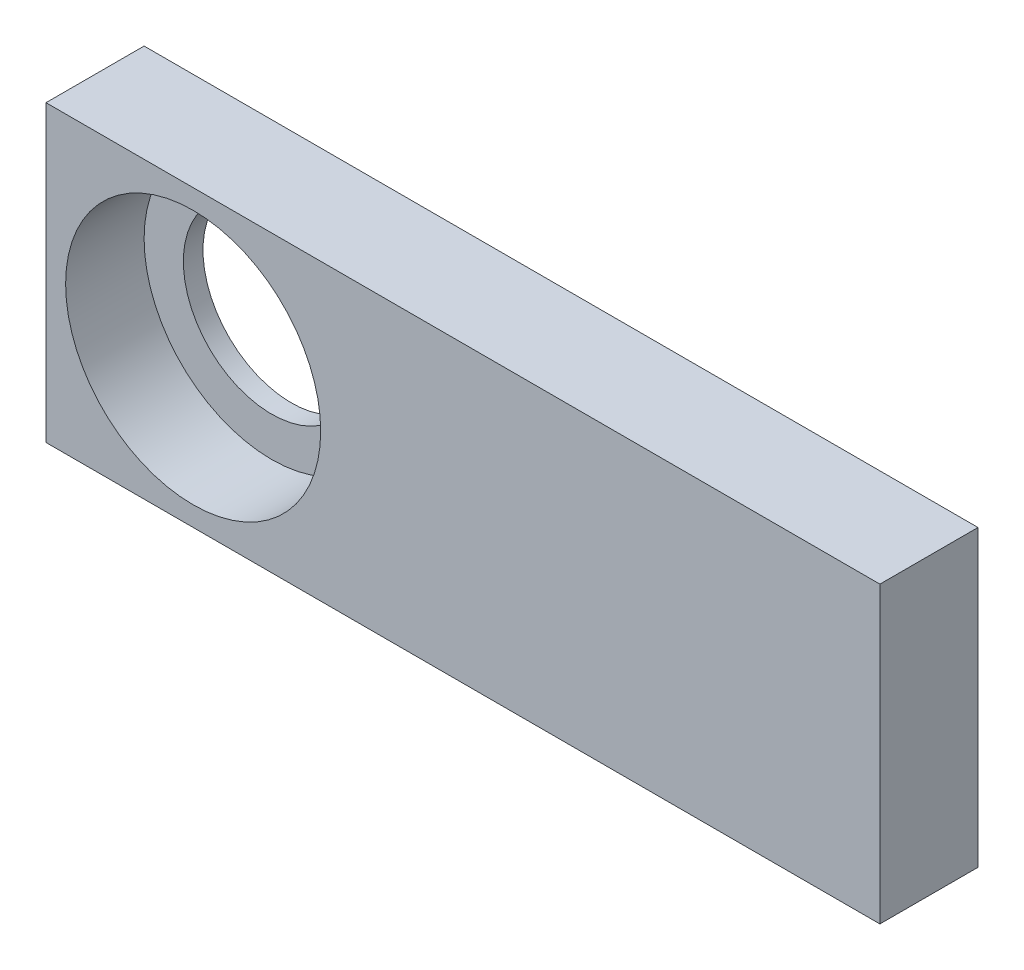
ISO-10303-21;
HEADER;
FILE_DESCRIPTION(('STEP AP214'),'2;1');
FILE_NAME('part.step','',(''),(''),'','','');
FILE_SCHEMA(('AUTOMOTIVE_DESIGN { 1 0 10303 214 1 1 1 1 }'));
ENDSEC;
DATA;
#1=APPLICATION_CONTEXT('core data for automotive mechanical design processes');
#2=APPLICATION_PROTOCOL_DEFINITION('international standard','automotive_design',2000,#1);
#3=PRODUCT_CONTEXT('',#1,'mechanical');
#4=PRODUCT('Part','Part','',(#3));
#5=PRODUCT_RELATED_PRODUCT_CATEGORY('part','',(#4));
#6=PRODUCT_DEFINITION_FORMATION('','',#4);
#7=PRODUCT_DEFINITION_CONTEXT('part definition',#1,'design');
#8=PRODUCT_DEFINITION('design','',#6,#7);
#9=PRODUCT_DEFINITION_SHAPE('','',#8);
#10=(LENGTH_UNIT() NAMED_UNIT(*) SI_UNIT(.MILLI.,.METRE.));
#11=(NAMED_UNIT(*) PLANE_ANGLE_UNIT() SI_UNIT($,.RADIAN.));
#12=(NAMED_UNIT(*) SI_UNIT($,.STERADIAN.) SOLID_ANGLE_UNIT());
#13=UNCERTAINTY_MEASURE_WITH_UNIT(LENGTH_MEASURE(1.E-05),#10,'distance_accuracy_value','');
#14=(GEOMETRIC_REPRESENTATION_CONTEXT(3) GLOBAL_UNCERTAINTY_ASSIGNED_CONTEXT((#13)) GLOBAL_UNIT_ASSIGNED_CONTEXT((#10,
#11,#12)) REPRESENTATION_CONTEXT('',''));
#15=CARTESIAN_POINT('',(0.,0.,0.));
#16=DIRECTION('',(0.,0.,1.));
#17=DIRECTION('',(1.,0.,0.));
#18=AXIS2_PLACEMENT_3D('',#15,#16,#17);
#19=CARTESIAN_POINT('',(-75.,15.,10.));
#20=DIRECTION('',(1.,0.,0.));
#21=DIRECTION('',(0.,0.,-1.));
#22=AXIS2_PLACEMENT_3D('',#19,#20,#21);
#23=PLANE('',#22);
#24=DIRECTION('',(0.,-1.,0.));
#25=VECTOR('',#24,1.);
#26=CARTESIAN_POINT('',(-75.,15.,0.));
#27=LINE('',#26,#25);
#28=CARTESIAN_POINT('',(-75.,15.,0.));
#29=VERTEX_POINT('',#28);
#30=CARTESIAN_POINT('',(-75.,-15.,0.));
#31=VERTEX_POINT('',#30);
#32=EDGE_CURVE('E82',#29,#31,#27,.T.);
#33=ORIENTED_EDGE('',*,*,#32,.T.);
#34=DIRECTION('',(0.,0.,-1.));
#35=VECTOR('',#34,1.);
#36=CARTESIAN_POINT('',(-75.,-15.,10.));
#37=LINE('',#36,#35);
#38=CARTESIAN_POINT('',(-75.,-15.,10.));
#39=VERTEX_POINT('',#38);
#40=EDGE_CURVE('E11',#39,#31,#37,.T.);
#41=ORIENTED_EDGE('',*,*,#40,.F.);
#42=DIRECTION('',(0.,-1.,0.));
#43=VECTOR('',#42,1.);
#44=CARTESIAN_POINT('',(-75.,15.,10.));
#45=LINE('',#44,#43);
#46=CARTESIAN_POINT('',(-75.,15.,10.));
#47=VERTEX_POINT('',#46);
#48=EDGE_CURVE('E76',#47,#39,#45,.T.);
#49=ORIENTED_EDGE('',*,*,#48,.F.);
#50=DIRECTION('',(0.,0.,-1.));
#51=VECTOR('',#50,1.);
#52=CARTESIAN_POINT('',(-75.,15.,10.));
#53=LINE('',#52,#51);
#54=EDGE_CURVE('E38',#47,#29,#53,.T.);
#55=ORIENTED_EDGE('',*,*,#54,.T.);
#56=EDGE_LOOP('',(#33,#41,#49,#55));
#57=FACE_BOUND('',#56,.T.);
#58=ADVANCED_FACE('F31',(#57),#23,.F.);
#59=CARTESIAN_POINT('',(-75.,-15.,10.));
#60=DIRECTION('',(0.,1.,0.));
#61=DIRECTION('',(0.,0.,1.));
#62=AXIS2_PLACEMENT_3D('',#59,#60,#61);
#63=PLANE('',#62);
#64=DIRECTION('',(1.,0.,0.));
#65=VECTOR('',#64,1.);
#66=CARTESIAN_POINT('',(-75.,-15.,0.));
#67=LINE('',#66,#65);
#68=CARTESIAN_POINT('',(10.,-15.,0.));
#69=VERTEX_POINT('',#68);
#70=EDGE_CURVE('E77',#31,#69,#67,.T.);
#71=ORIENTED_EDGE('',*,*,#70,.T.);
#72=DIRECTION('',(0.,0.,-1.));
#73=VECTOR('',#72,1.);
#74=CARTESIAN_POINT('',(10.,-15.,0.));
#75=LINE('',#74,#73);
#76=CARTESIAN_POINT('',(10.,-15.,10.));
#77=VERTEX_POINT('',#76);
#78=EDGE_CURVE('E45',#77,#69,#75,.T.);
#79=ORIENTED_EDGE('',*,*,#78,.F.);
#80=DIRECTION('',(1.,0.,0.));
#81=VECTOR('',#80,1.);
#82=CARTESIAN_POINT('',(-75.,-15.,10.));
#83=LINE('',#82,#81);
#84=EDGE_CURVE('E93',#39,#77,#83,.T.);
#85=ORIENTED_EDGE('',*,*,#84,.F.);
#86=ORIENTED_EDGE('',*,*,#40,.T.);
#87=EDGE_LOOP('',(#71,#79,#85,#86));
#88=FACE_BOUND('',#87,.T.);
#89=ADVANCED_FACE('F118',(#88),#63,.F.);
#90=CARTESIAN_POINT('',(-75.,15.,10.));
#91=DIRECTION('',(0.,-1.,0.));
#92=DIRECTION('',(0.,0.,-1.));
#93=AXIS2_PLACEMENT_3D('',#90,#91,#92);
#94=PLANE('',#93);
#95=DIRECTION('',(-1.,0.,0.));
#96=VECTOR('',#95,1.);
#97=CARTESIAN_POINT('',(-75.,15.,10.));
#98=LINE('',#97,#96);
#99=CARTESIAN_POINT('',(10.,15.,10.));
#100=VERTEX_POINT('',#99);
#101=EDGE_CURVE('E54',#100,#47,#98,.T.);
#102=ORIENTED_EDGE('',*,*,#101,.F.);
#103=DIRECTION('',(0.,0.,1.));
#104=VECTOR('',#103,1.);
#105=CARTESIAN_POINT('',(10.,15.,0.));
#106=LINE('',#105,#104);
#107=CARTESIAN_POINT('',(10.,15.,0.));
#108=VERTEX_POINT('',#107);
#109=EDGE_CURVE('E73',#108,#100,#106,.T.);
#110=ORIENTED_EDGE('',*,*,#109,.F.);
#111=DIRECTION('',(-1.,0.,0.));
#112=VECTOR('',#111,1.);
#113=CARTESIAN_POINT('',(-75.,15.,0.));
#114=LINE('',#113,#112);
#115=EDGE_CURVE('E68',#108,#29,#114,.T.);
#116=ORIENTED_EDGE('',*,*,#115,.T.);
#117=ORIENTED_EDGE('',*,*,#54,.F.);
#118=EDGE_LOOP('',(#102,#110,#116,#117));
#119=FACE_BOUND('',#118,.T.);
#120=ADVANCED_FACE('F70',(#119),#94,.F.);
#121=CARTESIAN_POINT('',(-75.,-15.,10.));
#122=DIRECTION('',(0.,0.,1.));
#123=DIRECTION('',(1.,0.,0.));
#124=AXIS2_PLACEMENT_3D('',#121,#122,#123);
#125=PLANE('',#124);
#126=DIRECTION('',(0.,-1.,0.));
#127=VECTOR('',#126,1.);
#128=CARTESIAN_POINT('',(10.,15.001,10.));
#129=LINE('',#128,#127);
#130=EDGE_CURVE('E106',#100,#77,#129,.T.);
#131=ORIENTED_EDGE('',*,*,#130,.F.);
#132=ORIENTED_EDGE('',*,*,#101,.T.);
#133=ORIENTED_EDGE('',*,*,#48,.T.);
#134=ORIENTED_EDGE('',*,*,#84,.T.);
#135=EDGE_LOOP('',(#131,#132,#133,#134));
#136=FACE_BOUND('',#135,.T.);
#137=CARTESIAN_POINT('',(-60.,0.,10.));
#138=DIRECTION('',(0.,0.,1.));
#139=DIRECTION('',(1.,0.,0.));
#140=AXIS2_PLACEMENT_3D('',#137,#138,#139);
#141=CIRCLE('',#140,13.);
#142=CARTESIAN_POINT('',(-47.,0.,10.));
#143=VERTEX_POINT('',#142);
#144=EDGE_CURVE('E89',#143,#143,#141,.T.);
#145=ORIENTED_EDGE('',*,*,#144,.F.);
#146=EDGE_LOOP('',(#145));
#147=FACE_BOUND('',#146,.T.);
#148=ADVANCED_FACE('F114',(#136,#147),#125,.T.);
#149=CARTESIAN_POINT('',(-75.,-15.,0.));
#150=DIRECTION('',(0.,0.,1.));
#151=DIRECTION('',(1.,0.,0.));
#152=AXIS2_PLACEMENT_3D('',#149,#150,#151);
#153=PLANE('',#152);
#154=CARTESIAN_POINT('',(-60.,0.,0.));
#155=DIRECTION('',(0.,0.,1.));
#156=DIRECTION('',(1.,0.,0.));
#157=AXIS2_PLACEMENT_3D('',#154,#155,#156);
#158=CIRCLE('',#157,9.);
#159=CARTESIAN_POINT('',(-51.,0.,0.));
#160=VERTEX_POINT('',#159);
#161=EDGE_CURVE('E98',#160,#160,#158,.F.);
#162=ORIENTED_EDGE('',*,*,#161,.F.);
#163=EDGE_LOOP('',(#162));
#164=FACE_BOUND('',#163,.T.);
#165=ORIENTED_EDGE('',*,*,#115,.F.);
#166=DIRECTION('',(0.,-1.,0.));
#167=VECTOR('',#166,1.);
#168=CARTESIAN_POINT('',(10.,15.001,0.));
#169=LINE('',#168,#167);
#170=EDGE_CURVE('E105',#108,#69,#169,.T.);
#171=ORIENTED_EDGE('',*,*,#170,.T.);
#172=ORIENTED_EDGE('',*,*,#70,.F.);
#173=ORIENTED_EDGE('',*,*,#32,.F.);
#174=EDGE_LOOP('',(#165,#171,#172,#173));
#175=FACE_BOUND('',#174,.T.);
#176=ADVANCED_FACE('F83',(#164,#175),#153,.F.);
#177=CARTESIAN_POINT('',(-60.,0.,2.));
#178=DIRECTION('',(0.,0.,1.));
#179=DIRECTION('',(1.,0.,0.));
#180=AXIS2_PLACEMENT_3D('',#177,#178,#179);
#181=CYLINDRICAL_SURFACE('',#180,13.);
#182=CARTESIAN_POINT('',(-60.,0.,2.));
#183=DIRECTION('',(0.,0.,1.));
#184=DIRECTION('',(1.,0.,0.));
#185=AXIS2_PLACEMENT_3D('',#182,#183,#184);
#186=CIRCLE('',#185,13.);
#187=CARTESIAN_POINT('',(-47.,0.,2.));
#188=VERTEX_POINT('',#187);
#189=EDGE_CURVE('E85',#188,#188,#186,.T.);
#190=ORIENTED_EDGE('',*,*,#189,.F.);
#191=EDGE_LOOP('',(#190));
#192=FACE_BOUND('',#191,.T.);
#193=ORIENTED_EDGE('',*,*,#144,.T.);
#194=EDGE_LOOP('',(#193));
#195=FACE_BOUND('',#194,.T.);
#196=ADVANCED_FACE('F128',(#192,#195),#181,.F.);
#197=CARTESIAN_POINT('',(-60.,0.,2.));
#198=DIRECTION('',(0.,0.,1.));
#199=DIRECTION('',(1.,0.,0.));
#200=AXIS2_PLACEMENT_3D('',#197,#198,#199);
#201=PLANE('',#200);
#202=CARTESIAN_POINT('',(-60.,0.,2.));
#203=DIRECTION('',(0.,0.,1.));
#204=DIRECTION('',(1.,0.,0.));
#205=AXIS2_PLACEMENT_3D('',#202,#203,#204);
#206=CIRCLE('',#205,9.);
#207=CARTESIAN_POINT('',(-51.,0.,2.));
#208=VERTEX_POINT('',#207);
#209=EDGE_CURVE('E102',#208,#208,#206,.T.);
#210=ORIENTED_EDGE('',*,*,#209,.F.);
#211=EDGE_LOOP('',(#210));
#212=FACE_BOUND('',#211,.T.);
#213=ORIENTED_EDGE('',*,*,#189,.T.);
#214=EDGE_LOOP('',(#213));
#215=FACE_BOUND('',#214,.T.);
#216=ADVANCED_FACE('F134',(#212,#215),#201,.T.);
#217=CARTESIAN_POINT('',(-60.,0.,-0.00100000000000013));
#218=DIRECTION('',(0.,0.,1.));
#219=DIRECTION('',(1.,0.,0.));
#220=AXIS2_PLACEMENT_3D('',#217,#218,#219);
#221=CYLINDRICAL_SURFACE('',#220,9.);
#222=ORIENTED_EDGE('',*,*,#209,.T.);
#223=EDGE_LOOP('',(#222));
#224=FACE_BOUND('',#223,.T.);
#225=ORIENTED_EDGE('',*,*,#161,.T.);
#226=EDGE_LOOP('',(#225));
#227=FACE_BOUND('',#226,.T.);
#228=ADVANCED_FACE('F138',(#224,#227),#221,.F.);
#229=CARTESIAN_POINT('',(10.,15.001,0.));
#230=DIRECTION('',(-1.,0.,0.));
#231=DIRECTION('',(0.,0.,1.));
#232=AXIS2_PLACEMENT_3D('',#229,#230,#231);
#233=PLANE('',#232);
#234=ORIENTED_EDGE('',*,*,#109,.T.);
#235=ORIENTED_EDGE('',*,*,#130,.T.);
#236=ORIENTED_EDGE('',*,*,#78,.T.);
#237=ORIENTED_EDGE('',*,*,#170,.F.);
#238=EDGE_LOOP('',(#234,#235,#236,#237));
#239=FACE_BOUND('',#238,.T.);
#240=ADVANCED_FACE('F111',(#239),#233,.F.);
#241=CLOSED_SHELL('',(#58,#89,#120,#148,#176,#196,#216,#228,#240));
#242=MANIFOLD_SOLID_BREP('B2',#241);
#243=ADVANCED_BREP_SHAPE_REPRESENTATION('',(#18,#242),#14);
#244=SHAPE_DEFINITION_REPRESENTATION(#9,#243);
ENDSEC;
END-ISO-10303-21;
